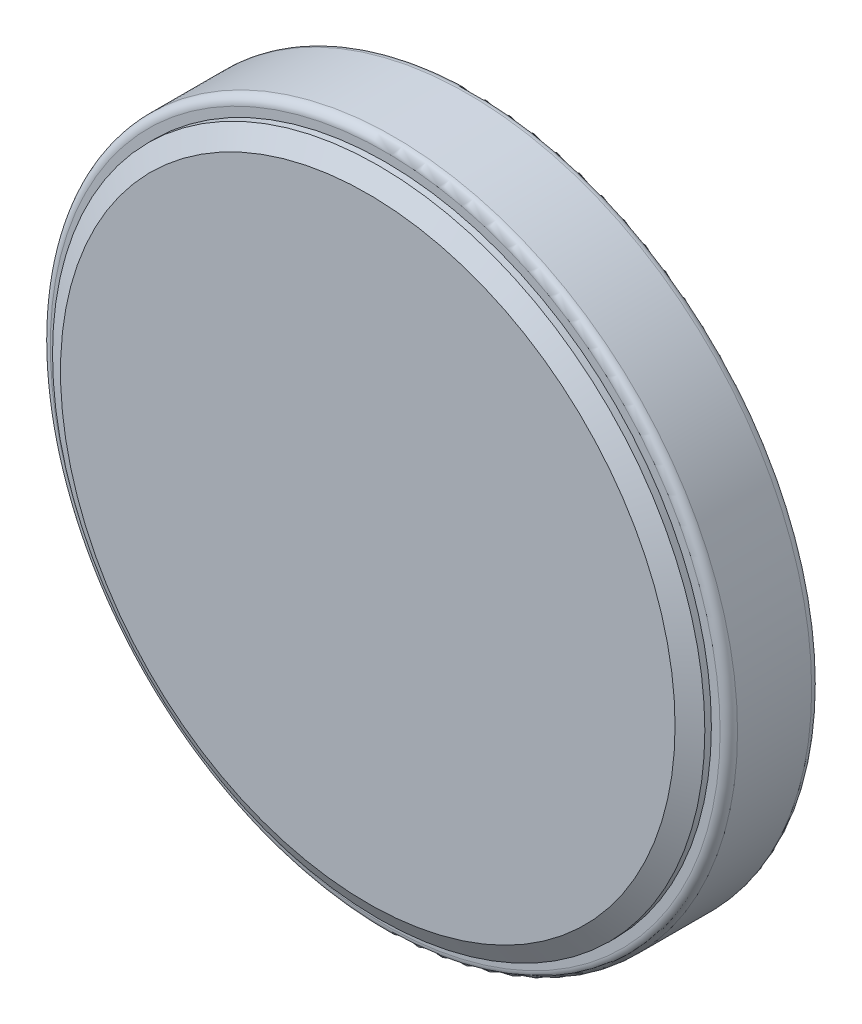
ISO-10303-21;
HEADER;
FILE_DESCRIPTION(('STEP AP214'),'2;1');
FILE_NAME('part.step','',(''),(''),'','','');
FILE_SCHEMA(('AUTOMOTIVE_DESIGN { 1 0 10303 214 1 1 1 1 }'));
ENDSEC;
DATA;
#1=APPLICATION_CONTEXT('core data for automotive mechanical design processes');
#2=APPLICATION_PROTOCOL_DEFINITION('international standard','automotive_design',2000,#1);
#3=PRODUCT_CONTEXT('',#1,'mechanical');
#4=PRODUCT('Part','Part','',(#3));
#5=PRODUCT_RELATED_PRODUCT_CATEGORY('part','',(#4));
#6=PRODUCT_DEFINITION_FORMATION('','',#4);
#7=PRODUCT_DEFINITION_CONTEXT('part definition',#1,'design');
#8=PRODUCT_DEFINITION('design','',#6,#7);
#9=PRODUCT_DEFINITION_SHAPE('','',#8);
#10=(LENGTH_UNIT() NAMED_UNIT(*) SI_UNIT(.MILLI.,.METRE.));
#11=(NAMED_UNIT(*) PLANE_ANGLE_UNIT() SI_UNIT($,.RADIAN.));
#12=(NAMED_UNIT(*) SI_UNIT($,.STERADIAN.) SOLID_ANGLE_UNIT());
#13=UNCERTAINTY_MEASURE_WITH_UNIT(LENGTH_MEASURE(1.E-05),#10,'distance_accuracy_value','');
#14=(GEOMETRIC_REPRESENTATION_CONTEXT(3) GLOBAL_UNCERTAINTY_ASSIGNED_CONTEXT((#13)) GLOBAL_UNIT_ASSIGNED_CONTEXT((#10,
#11,#12)) REPRESENTATION_CONTEXT('',''));
#15=CARTESIAN_POINT('',(0.,0.,0.));
#16=DIRECTION('',(0.,0.,1.));
#17=DIRECTION('',(1.,0.,0.));
#18=AXIS2_PLACEMENT_3D('',#15,#16,#17);
#19=CARTESIAN_POINT('',(0.,0.,-2.667));
#20=DIRECTION('',(0.,0.,1.));
#21=DIRECTION('',(1.,0.,0.));
#22=AXIS2_PLACEMENT_3D('',#19,#20,#21);
#23=CYLINDRICAL_SURFACE('',#22,10.0076);
#24=CARTESIAN_POINT('',(0.,0.,-0.254));
#25=DIRECTION('',(0.,0.,1.));
#26=DIRECTION('',(1.,0.,0.));
#27=AXIS2_PLACEMENT_3D('',#24,#25,#26);
#28=CIRCLE('',#27,10.0076);
#29=CARTESIAN_POINT('',(10.0076,0.,-0.254));
#30=VERTEX_POINT('',#29);
#31=EDGE_CURVE('E221',#30,#30,#28,.F.);
#32=ORIENTED_EDGE('',*,*,#31,.T.);
#33=EDGE_LOOP('',(#32));
#34=FACE_BOUND('',#33,.T.);
#35=CARTESIAN_POINT('',(0.,0.,-2.413));
#36=DIRECTION('',(0.,0.,1.));
#37=DIRECTION('',(1.,0.,0.));
#38=AXIS2_PLACEMENT_3D('',#35,#36,#37);
#39=CIRCLE('',#38,10.0076);
#40=CARTESIAN_POINT('',(10.0076,0.,-2.413));
#41=VERTEX_POINT('',#40);
#42=EDGE_CURVE('E212',#41,#41,#39,.T.);
#43=ORIENTED_EDGE('',*,*,#42,.T.);
#44=EDGE_LOOP('',(#43));
#45=FACE_BOUND('',#44,.T.);
#46=ADVANCED_FACE('F36',(#34,#45),#23,.T.);
#47=CARTESIAN_POINT('',(0.,0.,-2.667));
#48=DIRECTION('',(0.,0.,1.));
#49=DIRECTION('',(1.,0.,0.));
#50=AXIS2_PLACEMENT_3D('',#47,#48,#49);
#51=PLANE('',#50);
#52=DIRECTION('',(1.,0.,0.));
#53=VECTOR('',#52,1.);
#54=CARTESIAN_POINT('',(0.253999999999998,0.254000000000003,-2.667));
#55=LINE('',#54,#53);
#56=CARTESIAN_POINT('',(0.253999999999998,0.254000000000003,-2.667));
#57=VERTEX_POINT('',#56);
#58=CARTESIAN_POINT('',(2.54,0.254,-2.667));
#59=VERTEX_POINT('',#58);
#60=EDGE_CURVE('E161',#57,#59,#55,.T.);
#61=ORIENTED_EDGE('',*,*,#60,.F.);
#62=DIRECTION('',(0.,-1.,0.));
#63=VECTOR('',#62,1.);
#64=CARTESIAN_POINT('',(0.253999999999998,2.54,-2.667));
#65=LINE('',#64,#63);
#66=CARTESIAN_POINT('',(0.253999999999998,2.54,-2.667));
#67=VERTEX_POINT('',#66);
#68=EDGE_CURVE('E51',#67,#57,#65,.T.);
#69=ORIENTED_EDGE('',*,*,#68,.F.);
#70=DIRECTION('',(1.,0.,0.));
#71=VECTOR('',#70,1.);
#72=CARTESIAN_POINT('',(0.253999999999998,2.54,-2.667));
#73=LINE('',#72,#71);
#74=CARTESIAN_POINT('',(-0.254000000000002,2.54,-2.667));
#75=VERTEX_POINT('',#74);
#76=EDGE_CURVE('E188',#75,#67,#73,.T.);
#77=ORIENTED_EDGE('',*,*,#76,.F.);
#78=DIRECTION('',(0.,1.,0.));
#79=VECTOR('',#78,1.);
#80=CARTESIAN_POINT('',(-0.254000000000002,2.54,-2.667));
#81=LINE('',#80,#79);
#82=CARTESIAN_POINT('',(-0.254000000000002,0.253999999999999,-2.667));
#83=VERTEX_POINT('',#82);
#84=EDGE_CURVE('E186',#83,#75,#81,.T.);
#85=ORIENTED_EDGE('',*,*,#84,.F.);
#86=DIRECTION('',(1.,0.,0.));
#87=VECTOR('',#86,1.);
#88=CARTESIAN_POINT('',(-0.254000000000002,0.253999999999999,-2.667));
#89=LINE('',#88,#87);
#90=CARTESIAN_POINT('',(-2.54,0.254,-2.667));
#91=VERTEX_POINT('',#90);
#92=EDGE_CURVE('E135',#91,#83,#89,.T.);
#93=ORIENTED_EDGE('',*,*,#92,.F.);
#94=DIRECTION('',(0.,1.,0.));
#95=VECTOR('',#94,1.);
#96=CARTESIAN_POINT('',(-2.54,0.254,-2.667));
#97=LINE('',#96,#95);
#98=CARTESIAN_POINT('',(-2.54,-0.254,-2.667));
#99=VERTEX_POINT('',#98);
#100=EDGE_CURVE('E182',#99,#91,#97,.T.);
#101=ORIENTED_EDGE('',*,*,#100,.F.);
#102=DIRECTION('',(-1.,0.,0.));
#103=VECTOR('',#102,1.);
#104=CARTESIAN_POINT('',(-0.254000000000001,-0.254,-2.667));
#105=LINE('',#104,#103);
#106=CARTESIAN_POINT('',(-0.254000000000001,-0.254,-2.667));
#107=VERTEX_POINT('',#106);
#108=EDGE_CURVE('E179',#107,#99,#105,.T.);
#109=ORIENTED_EDGE('',*,*,#108,.F.);
#110=DIRECTION('',(0.,1.,0.));
#111=VECTOR('',#110,1.);
#112=CARTESIAN_POINT('',(-0.254000000000001,-0.254,-2.667));
#113=LINE('',#112,#111);
#114=CARTESIAN_POINT('',(-0.254000000000002,-2.54,-2.667));
#115=VERTEX_POINT('',#114);
#116=EDGE_CURVE('E176',#115,#107,#113,.T.);
#117=ORIENTED_EDGE('',*,*,#116,.F.);
#118=DIRECTION('',(-1.,0.,0.));
#119=VECTOR('',#118,1.);
#120=CARTESIAN_POINT('',(0.253999999999998,-2.54,-2.667));
#121=LINE('',#120,#119);
#122=CARTESIAN_POINT('',(0.253999999999998,-2.54,-2.667));
#123=VERTEX_POINT('',#122);
#124=EDGE_CURVE('E173',#123,#115,#121,.T.);
#125=ORIENTED_EDGE('',*,*,#124,.F.);
#126=DIRECTION('',(0.,-1.,0.));
#127=VECTOR('',#126,1.);
#128=CARTESIAN_POINT('',(0.253999999999999,-0.254,-2.667));
#129=LINE('',#128,#127);
#130=CARTESIAN_POINT('',(0.253999999999999,-0.254,-2.667));
#131=VERTEX_POINT('',#130);
#132=EDGE_CURVE('E170',#131,#123,#129,.T.);
#133=ORIENTED_EDGE('',*,*,#132,.F.);
#134=DIRECTION('',(-1.,0.,0.));
#135=VECTOR('',#134,1.);
#136=CARTESIAN_POINT('',(0.253999999999999,-0.254,-2.667));
#137=LINE('',#136,#135);
#138=CARTESIAN_POINT('',(2.54,-0.254,-2.667));
#139=VERTEX_POINT('',#138);
#140=EDGE_CURVE('E167',#139,#131,#137,.T.);
#141=ORIENTED_EDGE('',*,*,#140,.F.);
#142=DIRECTION('',(0.,-1.,0.));
#143=VECTOR('',#142,1.);
#144=CARTESIAN_POINT('',(2.54,0.254,-2.667));
#145=LINE('',#144,#143);
#146=EDGE_CURVE('E164',#59,#139,#145,.T.);
#147=ORIENTED_EDGE('',*,*,#146,.F.);
#148=EDGE_LOOP('',(#61,#69,#77,#85,#93,#101,#109,#117,#125,#133,#141,#147));
#149=FACE_BOUND('',#148,.T.);
#150=CARTESIAN_POINT('',(0.,0.,-2.667));
#151=DIRECTION('',(0.,0.,1.));
#152=DIRECTION('',(1.,0.,0.));
#153=AXIS2_PLACEMENT_3D('',#150,#151,#152);
#154=CIRCLE('',#153,9.7536);
#155=CARTESIAN_POINT('',(9.7536,0.,-2.667));
#156=VERTEX_POINT('',#155);
#157=EDGE_CURVE('E215',#156,#156,#154,.F.);
#158=ORIENTED_EDGE('',*,*,#157,.T.);
#159=EDGE_LOOP('',(#158));
#160=FACE_BOUND('',#159,.T.);
#161=ADVANCED_FACE('F241',(#149,#160),#51,.F.);
#162=CARTESIAN_POINT('',(0.,0.,0.));
#163=DIRECTION('',(0.,0.,1.));
#164=DIRECTION('',(1.,0.,0.));
#165=AXIS2_PLACEMENT_3D('',#162,#163,#164);
#166=PLANE('',#165);
#167=CARTESIAN_POINT('',(0.,0.,0.));
#168=DIRECTION('',(0.,0.,1.));
#169=DIRECTION('',(1.,0.,0.));
#170=AXIS2_PLACEMENT_3D('',#167,#168,#169);
#171=CIRCLE('',#170,9.4996);
#172=CARTESIAN_POINT('',(9.4996,0.,0.));
#173=VERTEX_POINT('',#172);
#174=EDGE_CURVE('E192',#173,#173,#171,.T.);
#175=ORIENTED_EDGE('',*,*,#174,.F.);
#176=EDGE_LOOP('',(#175));
#177=FACE_BOUND('',#176,.T.);
#178=CARTESIAN_POINT('',(0.,0.,0.));
#179=DIRECTION('',(0.,0.,1.));
#180=DIRECTION('',(1.,0.,0.));
#181=AXIS2_PLACEMENT_3D('',#178,#179,#180);
#182=CIRCLE('',#181,9.7536);
#183=CARTESIAN_POINT('',(9.7536,0.,0.));
#184=VERTEX_POINT('',#183);
#185=EDGE_CURVE('E218',#184,#184,#182,.T.);
#186=ORIENTED_EDGE('',*,*,#185,.T.);
#187=EDGE_LOOP('',(#186));
#188=FACE_BOUND('',#187,.T.);
#189=ADVANCED_FACE('F247',(#177,#188),#166,.T.);
#190=CARTESIAN_POINT('',(0.,0.,-2.413));
#191=DIRECTION('',(0.,0.,1.));
#192=DIRECTION('',(1.,0.,0.));
#193=AXIS2_PLACEMENT_3D('',#190,#191,#192);
#194=TOROIDAL_SURFACE('',#193,9.7536,0.254);
#195=ORIENTED_EDGE('',*,*,#157,.F.);
#196=EDGE_LOOP('',(#195));
#197=FACE_BOUND('',#196,.T.);
#198=ORIENTED_EDGE('',*,*,#42,.F.);
#199=EDGE_LOOP('',(#198));
#200=FACE_BOUND('',#199,.T.);
#201=ADVANCED_FACE('F253',(#197,#200),#194,.T.);
#202=CARTESIAN_POINT('',(0.,0.,-0.254));
#203=DIRECTION('',(0.,0.,1.));
#204=DIRECTION('',(1.,0.,0.));
#205=AXIS2_PLACEMENT_3D('',#202,#203,#204);
#206=TOROIDAL_SURFACE('',#205,9.7536,0.254);
#207=ORIENTED_EDGE('',*,*,#31,.F.);
#208=EDGE_LOOP('',(#207));
#209=FACE_BOUND('',#208,.T.);
#210=ORIENTED_EDGE('',*,*,#185,.F.);
#211=EDGE_LOOP('',(#210));
#212=FACE_BOUND('',#211,.T.);
#213=ADVANCED_FACE('F255',(#209,#212),#206,.T.);
#214=CARTESIAN_POINT('',(0.,0.,32.7109263142389));
#215=DIRECTION('',(0.,0.,-1.));
#216=DIRECTION('',(-1.,0.,0.));
#217=AXIS2_PLACEMENT_3D('',#214,#215,#216);
#218=CYLINDRICAL_SURFACE('',#217,9.4996);
#219=CARTESIAN_POINT('',(0.,0.,0.190500000000003));
#220=DIRECTION('',(0.,0.,1.));
#221=DIRECTION('',(1.,0.,0.));
#222=AXIS2_PLACEMENT_3D('',#219,#220,#221);
#223=CIRCLE('',#222,9.4996);
#224=CARTESIAN_POINT('',(9.4996,0.,0.190500000000003));
#225=VERTEX_POINT('',#224);
#226=EDGE_CURVE('E12',#225,#225,#223,.F.);
#227=ORIENTED_EDGE('',*,*,#226,.T.);
#228=EDGE_LOOP('',(#227));
#229=FACE_BOUND('',#228,.T.);
#230=ORIENTED_EDGE('',*,*,#174,.T.);
#231=EDGE_LOOP('',(#230));
#232=FACE_BOUND('',#231,.T.);
#233=ADVANCED_FACE('F237',(#229,#232),#218,.T.);
#234=CARTESIAN_POINT('',(0.,0.,0.508));
#235=DIRECTION('',(0.,0.,1.));
#236=DIRECTION('',(1.,0.,0.));
#237=AXIS2_PLACEMENT_3D('',#234,#235,#236);
#238=PLANE('',#237);
#239=CARTESIAN_POINT('',(0.,0.,0.508));
#240=DIRECTION('',(0.,0.,1.));
#241=DIRECTION('',(1.,0.,0.));
#242=AXIS2_PLACEMENT_3D('',#239,#240,#241);
#243=CIRCLE('',#242,8.94967386859689);
#244=CARTESIAN_POINT('',(8.94967386859689,0.,0.508));
#245=VERTEX_POINT('',#244);
#246=EDGE_CURVE('E44',#245,#245,#243,.T.);
#247=ORIENTED_EDGE('',*,*,#246,.T.);
#248=EDGE_LOOP('',(#247));
#249=FACE_BOUND('',#248,.T.);
#250=ADVANCED_FACE('F226',(#249),#238,.T.);
#251=CARTESIAN_POINT('',(0.,0.,0.508000000000002));
#252=DIRECTION('',(0.,0.,-1.));
#253=DIRECTION('',(-1.,0.,0.));
#254=AXIS2_PLACEMENT_3D('',#251,#252,#253);
#255=CONICAL_SURFACE('',#254,8.94967386859689,1.04719755119659);
#256=ORIENTED_EDGE('',*,*,#226,.F.);
#257=EDGE_LOOP('',(#256));
#258=FACE_BOUND('',#257,.T.);
#259=ORIENTED_EDGE('',*,*,#246,.F.);
#260=EDGE_LOOP('',(#259));
#261=FACE_BOUND('',#260,.T.);
#262=ADVANCED_FACE('F38',(#258,#261),#255,.T.);
#263=CARTESIAN_POINT('',(0.253999999999998,2.54,-2.413));
#264=DIRECTION('',(1.,0.,0.));
#265=DIRECTION('',(0.,1.,0.));
#266=AXIS2_PLACEMENT_3D('',#263,#264,#265);
#267=PLANE('',#266);
#268=ORIENTED_EDGE('',*,*,#68,.T.);
#269=DIRECTION('',(0.,0.,-1.));
#270=VECTOR('',#269,1.);
#271=CARTESIAN_POINT('',(0.253999999999998,0.254000000000003,-2.413));
#272=LINE('',#271,#270);
#273=CARTESIAN_POINT('',(0.253999999999998,0.254000000000003,-2.413));
#274=VERTEX_POINT('',#273);
#275=EDGE_CURVE('E99',#274,#57,#272,.T.);
#276=ORIENTED_EDGE('',*,*,#275,.F.);
#277=DIRECTION('',(0.,-1.,0.));
#278=VECTOR('',#277,1.);
#279=CARTESIAN_POINT('',(0.253999999999998,2.54,-2.413));
#280=LINE('',#279,#278);
#281=CARTESIAN_POINT('',(0.253999999999998,2.54,-2.413));
#282=VERTEX_POINT('',#281);
#283=EDGE_CURVE('E190',#282,#274,#280,.T.);
#284=ORIENTED_EDGE('',*,*,#283,.F.);
#285=DIRECTION('',(0.,0.,-1.));
#286=VECTOR('',#285,1.);
#287=CARTESIAN_POINT('',(0.253999999999998,2.54,-2.413));
#288=LINE('',#287,#286);
#289=EDGE_CURVE('E59',#282,#67,#288,.T.);
#290=ORIENTED_EDGE('',*,*,#289,.T.);
#291=EDGE_LOOP('',(#268,#276,#284,#290));
#292=FACE_BOUND('',#291,.T.);
#293=ADVANCED_FACE('F229',(#292),#267,.F.);
#294=CARTESIAN_POINT('',(0.253999999999998,2.54,-2.413));
#295=DIRECTION('',(0.,1.,0.));
#296=DIRECTION('',(0.,0.,1.));
#297=AXIS2_PLACEMENT_3D('',#294,#295,#296);
#298=PLANE('',#297);
#299=ORIENTED_EDGE('',*,*,#76,.T.);
#300=ORIENTED_EDGE('',*,*,#289,.F.);
#301=DIRECTION('',(1.,0.,0.));
#302=VECTOR('',#301,1.);
#303=CARTESIAN_POINT('',(0.253999999999998,2.54,-2.413));
#304=LINE('',#303,#302);
#305=CARTESIAN_POINT('',(-0.254000000000002,2.54,-2.413));
#306=VERTEX_POINT('',#305);
#307=EDGE_CURVE('E147',#306,#282,#304,.T.);
#308=ORIENTED_EDGE('',*,*,#307,.F.);
#309=DIRECTION('',(0.,0.,-1.));
#310=VECTOR('',#309,1.);
#311=CARTESIAN_POINT('',(-0.254000000000002,2.54,-2.413));
#312=LINE('',#311,#310);
#313=EDGE_CURVE('E139',#306,#75,#312,.T.);
#314=ORIENTED_EDGE('',*,*,#313,.T.);
#315=EDGE_LOOP('',(#299,#300,#308,#314));
#316=FACE_BOUND('',#315,.T.);
#317=ADVANCED_FACE('F235',(#316),#298,.F.);
#318=CARTESIAN_POINT('',(-0.254000000000002,2.54,-2.413));
#319=DIRECTION('',(-1.,0.,0.));
#320=DIRECTION('',(0.,-1.,0.));
#321=AXIS2_PLACEMENT_3D('',#318,#319,#320);
#322=PLANE('',#321);
#323=ORIENTED_EDGE('',*,*,#84,.T.);
#324=ORIENTED_EDGE('',*,*,#313,.F.);
#325=DIRECTION('',(0.,1.,0.));
#326=VECTOR('',#325,1.);
#327=CARTESIAN_POINT('',(-0.254000000000002,2.54,-2.413));
#328=LINE('',#327,#326);
#329=CARTESIAN_POINT('',(-0.254000000000002,0.253999999999999,-2.413));
#330=VERTEX_POINT('',#329);
#331=EDGE_CURVE('E143',#330,#306,#328,.T.);
#332=ORIENTED_EDGE('',*,*,#331,.F.);
#333=DIRECTION('',(0.,0.,-1.));
#334=VECTOR('',#333,1.);
#335=CARTESIAN_POINT('',(-0.254000000000002,0.253999999999999,-2.413));
#336=LINE('',#335,#334);
#337=EDGE_CURVE('E128',#330,#83,#336,.T.);
#338=ORIENTED_EDGE('',*,*,#337,.T.);
#339=EDGE_LOOP('',(#323,#324,#332,#338));
#340=FACE_BOUND('',#339,.T.);
#341=ADVANCED_FACE('F144',(#340),#322,.F.);
#342=CARTESIAN_POINT('',(-0.254000000000002,0.253999999999999,-2.413));
#343=DIRECTION('',(0.,1.,0.));
#344=DIRECTION('',(-1.,0.,0.));
#345=AXIS2_PLACEMENT_3D('',#342,#343,#344);
#346=PLANE('',#345);
#347=ORIENTED_EDGE('',*,*,#92,.T.);
#348=ORIENTED_EDGE('',*,*,#337,.F.);
#349=DIRECTION('',(1.,0.,0.));
#350=VECTOR('',#349,1.);
#351=CARTESIAN_POINT('',(-0.254000000000002,0.253999999999999,-2.413));
#352=LINE('',#351,#350);
#353=CARTESIAN_POINT('',(-2.54,0.254,-2.413));
#354=VERTEX_POINT('',#353);
#355=EDGE_CURVE('E132',#354,#330,#352,.T.);
#356=ORIENTED_EDGE('',*,*,#355,.F.);
#357=DIRECTION('',(0.,0.,-1.));
#358=VECTOR('',#357,1.);
#359=CARTESIAN_POINT('',(-2.54,0.254,-2.413));
#360=LINE('',#359,#358);
#361=EDGE_CURVE('E140',#354,#91,#360,.T.);
#362=ORIENTED_EDGE('',*,*,#361,.T.);
#363=EDGE_LOOP('',(#347,#348,#356,#362));
#364=FACE_BOUND('',#363,.T.);
#365=ADVANCED_FACE('F130',(#364),#346,.F.);
#366=CARTESIAN_POINT('',(-2.54,0.254,-2.413));
#367=DIRECTION('',(-1.,0.,0.));
#368=DIRECTION('',(0.,0.,1.));
#369=AXIS2_PLACEMENT_3D('',#366,#367,#368);
#370=PLANE('',#369);
#371=ORIENTED_EDGE('',*,*,#100,.T.);
#372=ORIENTED_EDGE('',*,*,#361,.F.);
#373=DIRECTION('',(0.,1.,0.));
#374=VECTOR('',#373,1.);
#375=CARTESIAN_POINT('',(-2.54,0.254,-2.413));
#376=LINE('',#375,#374);
#377=CARTESIAN_POINT('',(-2.54,-0.254,-2.413));
#378=VERTEX_POINT('',#377);
#379=EDGE_CURVE('E153',#378,#354,#376,.T.);
#380=ORIENTED_EDGE('',*,*,#379,.F.);
#381=DIRECTION('',(0.,0.,-1.));
#382=VECTOR('',#381,1.);
#383=CARTESIAN_POINT('',(-2.54,-0.254,-2.413));
#384=LINE('',#383,#382);
#385=EDGE_CURVE('E195',#378,#99,#384,.T.);
#386=ORIENTED_EDGE('',*,*,#385,.T.);
#387=EDGE_LOOP('',(#371,#372,#380,#386));
#388=FACE_BOUND('',#387,.T.);
#389=ADVANCED_FACE('F343',(#388),#370,.F.);
#390=CARTESIAN_POINT('',(-0.254000000000001,-0.254,-2.413));
#391=DIRECTION('',(0.,-1.,0.));
#392=DIRECTION('',(1.,0.,0.));
#393=AXIS2_PLACEMENT_3D('',#390,#391,#392);
#394=PLANE('',#393);
#395=ORIENTED_EDGE('',*,*,#108,.T.);
#396=ORIENTED_EDGE('',*,*,#385,.F.);
#397=DIRECTION('',(-1.,0.,0.));
#398=VECTOR('',#397,1.);
#399=CARTESIAN_POINT('',(-0.254000000000001,-0.254,-2.413));
#400=LINE('',#399,#398);
#401=CARTESIAN_POINT('',(-0.254000000000001,-0.254,-2.413));
#402=VERTEX_POINT('',#401);
#403=EDGE_CURVE('E155',#402,#378,#400,.T.);
#404=ORIENTED_EDGE('',*,*,#403,.F.);
#405=DIRECTION('',(0.,0.,-1.));
#406=VECTOR('',#405,1.);
#407=CARTESIAN_POINT('',(-0.254000000000001,-0.254,-2.413));
#408=LINE('',#407,#406);
#409=EDGE_CURVE('E197',#402,#107,#408,.T.);
#410=ORIENTED_EDGE('',*,*,#409,.T.);
#411=EDGE_LOOP('',(#395,#396,#404,#410));
#412=FACE_BOUND('',#411,.T.);
#413=ADVANCED_FACE('F352',(#412),#394,.F.);
#414=CARTESIAN_POINT('',(-0.254000000000001,-0.254,-2.413));
#415=DIRECTION('',(-1.,0.,0.));
#416=DIRECTION('',(0.,-1.,0.));
#417=AXIS2_PLACEMENT_3D('',#414,#415,#416);
#418=PLANE('',#417);
#419=ORIENTED_EDGE('',*,*,#116,.T.);
#420=ORIENTED_EDGE('',*,*,#409,.F.);
#421=DIRECTION('',(0.,1.,0.));
#422=VECTOR('',#421,1.);
#423=CARTESIAN_POINT('',(-0.254000000000001,-0.254,-2.413));
#424=LINE('',#423,#422);
#425=CARTESIAN_POINT('',(-0.254000000000002,-2.54,-2.413));
#426=VERTEX_POINT('',#425);
#427=EDGE_CURVE('E458',#426,#402,#424,.T.);
#428=ORIENTED_EDGE('',*,*,#427,.F.);
#429=DIRECTION('',(0.,0.,-1.));
#430=VECTOR('',#429,1.);
#431=CARTESIAN_POINT('',(-0.254000000000002,-2.54,-2.413));
#432=LINE('',#431,#430);
#433=EDGE_CURVE('E199',#426,#115,#432,.T.);
#434=ORIENTED_EDGE('',*,*,#433,.T.);
#435=EDGE_LOOP('',(#419,#420,#428,#434));
#436=FACE_BOUND('',#435,.T.);
#437=ADVANCED_FACE('F362',(#436),#418,.F.);
#438=CARTESIAN_POINT('',(0.253999999999998,-2.54,-2.413));
#439=DIRECTION('',(0.,-1.,0.));
#440=DIRECTION('',(0.,0.,-1.));
#441=AXIS2_PLACEMENT_3D('',#438,#439,#440);
#442=PLANE('',#441);
#443=ORIENTED_EDGE('',*,*,#124,.T.);
#444=ORIENTED_EDGE('',*,*,#433,.F.);
#445=DIRECTION('',(-1.,0.,0.));
#446=VECTOR('',#445,1.);
#447=CARTESIAN_POINT('',(0.253999999999998,-2.54,-2.413));
#448=LINE('',#447,#446);
#449=CARTESIAN_POINT('',(0.253999999999998,-2.54,-2.413));
#450=VERTEX_POINT('',#449);
#451=EDGE_CURVE('E455',#450,#426,#448,.T.);
#452=ORIENTED_EDGE('',*,*,#451,.F.);
#453=DIRECTION('',(0.,0.,-1.));
#454=VECTOR('',#453,1.);
#455=CARTESIAN_POINT('',(0.253999999999998,-2.54,-2.413));
#456=LINE('',#455,#454);
#457=EDGE_CURVE('E201',#450,#123,#456,.T.);
#458=ORIENTED_EDGE('',*,*,#457,.T.);
#459=EDGE_LOOP('',(#443,#444,#452,#458));
#460=FACE_BOUND('',#459,.T.);
#461=ADVANCED_FACE('F372',(#460),#442,.F.);
#462=CARTESIAN_POINT('',(0.253999999999999,-0.254,-2.413));
#463=DIRECTION('',(1.,0.,0.));
#464=DIRECTION('',(0.,1.,0.));
#465=AXIS2_PLACEMENT_3D('',#462,#463,#464);
#466=PLANE('',#465);
#467=ORIENTED_EDGE('',*,*,#132,.T.);
#468=ORIENTED_EDGE('',*,*,#457,.F.);
#469=DIRECTION('',(0.,-1.,0.));
#470=VECTOR('',#469,1.);
#471=CARTESIAN_POINT('',(0.253999999999999,-0.254,-2.413));
#472=LINE('',#471,#470);
#473=CARTESIAN_POINT('',(0.253999999999999,-0.254,-2.413));
#474=VERTEX_POINT('',#473);
#475=EDGE_CURVE('E452',#474,#450,#472,.T.);
#476=ORIENTED_EDGE('',*,*,#475,.F.);
#477=DIRECTION('',(0.,0.,-1.));
#478=VECTOR('',#477,1.);
#479=CARTESIAN_POINT('',(0.253999999999999,-0.254,-2.413));
#480=LINE('',#479,#478);
#481=EDGE_CURVE('E203',#474,#131,#480,.T.);
#482=ORIENTED_EDGE('',*,*,#481,.T.);
#483=EDGE_LOOP('',(#467,#468,#476,#482));
#484=FACE_BOUND('',#483,.T.);
#485=ADVANCED_FACE('F382',(#484),#466,.F.);
#486=CARTESIAN_POINT('',(0.253999999999999,-0.254,-2.413));
#487=DIRECTION('',(0.,-1.,0.));
#488=DIRECTION('',(1.,0.,0.));
#489=AXIS2_PLACEMENT_3D('',#486,#487,#488);
#490=PLANE('',#489);
#491=ORIENTED_EDGE('',*,*,#140,.T.);
#492=ORIENTED_EDGE('',*,*,#481,.F.);
#493=DIRECTION('',(-1.,0.,0.));
#494=VECTOR('',#493,1.);
#495=CARTESIAN_POINT('',(0.253999999999999,-0.254,-2.413));
#496=LINE('',#495,#494);
#497=CARTESIAN_POINT('',(2.54,-0.254,-2.413));
#498=VERTEX_POINT('',#497);
#499=EDGE_CURVE('E445',#498,#474,#496,.T.);
#500=ORIENTED_EDGE('',*,*,#499,.F.);
#501=DIRECTION('',(0.,0.,-1.));
#502=VECTOR('',#501,1.);
#503=CARTESIAN_POINT('',(2.54,-0.254,-2.413));
#504=LINE('',#503,#502);
#505=EDGE_CURVE('E205',#498,#139,#504,.T.);
#506=ORIENTED_EDGE('',*,*,#505,.T.);
#507=EDGE_LOOP('',(#491,#492,#500,#506));
#508=FACE_BOUND('',#507,.T.);
#509=ADVANCED_FACE('F392',(#508),#490,.F.);
#510=CARTESIAN_POINT('',(2.54,0.254,-2.413));
#511=DIRECTION('',(1.,0.,0.));
#512=DIRECTION('',(0.,1.,0.));
#513=AXIS2_PLACEMENT_3D('',#510,#511,#512);
#514=PLANE('',#513);
#515=ORIENTED_EDGE('',*,*,#146,.T.);
#516=ORIENTED_EDGE('',*,*,#505,.F.);
#517=DIRECTION('',(0.,-1.,0.));
#518=VECTOR('',#517,1.);
#519=CARTESIAN_POINT('',(2.54,0.254,-2.413));
#520=LINE('',#519,#518);
#521=CARTESIAN_POINT('',(2.54,0.254,-2.413));
#522=VERTEX_POINT('',#521);
#523=EDGE_CURVE('E442',#522,#498,#520,.T.);
#524=ORIENTED_EDGE('',*,*,#523,.F.);
#525=DIRECTION('',(0.,0.,-1.));
#526=VECTOR('',#525,1.);
#527=CARTESIAN_POINT('',(2.54,0.254,-2.413));
#528=LINE('',#527,#526);
#529=EDGE_CURVE('E207',#522,#59,#528,.T.);
#530=ORIENTED_EDGE('',*,*,#529,.T.);
#531=EDGE_LOOP('',(#515,#516,#524,#530));
#532=FACE_BOUND('',#531,.T.);
#533=ADVANCED_FACE('F402',(#532),#514,.F.);
#534=CARTESIAN_POINT('',(0.253999999999998,0.254000000000003,-2.413));
#535=DIRECTION('',(0.,1.,0.));
#536=DIRECTION('',(-1.,0.,0.));
#537=AXIS2_PLACEMENT_3D('',#534,#535,#536);
#538=PLANE('',#537);
#539=ORIENTED_EDGE('',*,*,#60,.T.);
#540=ORIENTED_EDGE('',*,*,#529,.F.);
#541=DIRECTION('',(1.,0.,0.));
#542=VECTOR('',#541,1.);
#543=CARTESIAN_POINT('',(0.253999999999998,0.254000000000003,-2.413));
#544=LINE('',#543,#542);
#545=EDGE_CURVE('E446',#274,#522,#544,.T.);
#546=ORIENTED_EDGE('',*,*,#545,.F.);
#547=ORIENTED_EDGE('',*,*,#275,.T.);
#548=EDGE_LOOP('',(#539,#540,#546,#547));
#549=FACE_BOUND('',#548,.T.);
#550=ADVANCED_FACE('F412',(#549),#538,.F.);
#551=CARTESIAN_POINT('',(0.253999999999999,-2.54,-2.413));
#552=DIRECTION('',(0.,0.,-1.));
#553=DIRECTION('',(-1.,0.,0.));
#554=AXIS2_PLACEMENT_3D('',#551,#552,#553);
#555=PLANE('',#554);
#556=ORIENTED_EDGE('',*,*,#283,.T.);
#557=ORIENTED_EDGE('',*,*,#545,.T.);
#558=ORIENTED_EDGE('',*,*,#523,.T.);
#559=ORIENTED_EDGE('',*,*,#499,.T.);
#560=ORIENTED_EDGE('',*,*,#475,.T.);
#561=ORIENTED_EDGE('',*,*,#451,.T.);
#562=ORIENTED_EDGE('',*,*,#427,.T.);
#563=ORIENTED_EDGE('',*,*,#403,.T.);
#564=ORIENTED_EDGE('',*,*,#379,.T.);
#565=ORIENTED_EDGE('',*,*,#355,.T.);
#566=ORIENTED_EDGE('',*,*,#331,.T.);
#567=ORIENTED_EDGE('',*,*,#307,.T.);
#568=EDGE_LOOP('',(#556,#557,#558,#559,#560,#561,#562,#563,#564,#565,#566,#567));
#569=FACE_BOUND('',#568,.T.);
#570=ADVANCED_FACE('F150',(#569),#555,.T.);
#571=CLOSED_SHELL('',(#46,#161,#189,#201,#213,#233,#250,#262,#293,#317,#341,#365,#389,#413,#437,
#461,#485,#509,#533,#550,#570));
#572=MANIFOLD_SOLID_BREP('B2',#571);
#573=ADVANCED_BREP_SHAPE_REPRESENTATION('',(#18,#572),#14);
#574=SHAPE_DEFINITION_REPRESENTATION(#9,#573);
ENDSEC;
END-ISO-10303-21;
